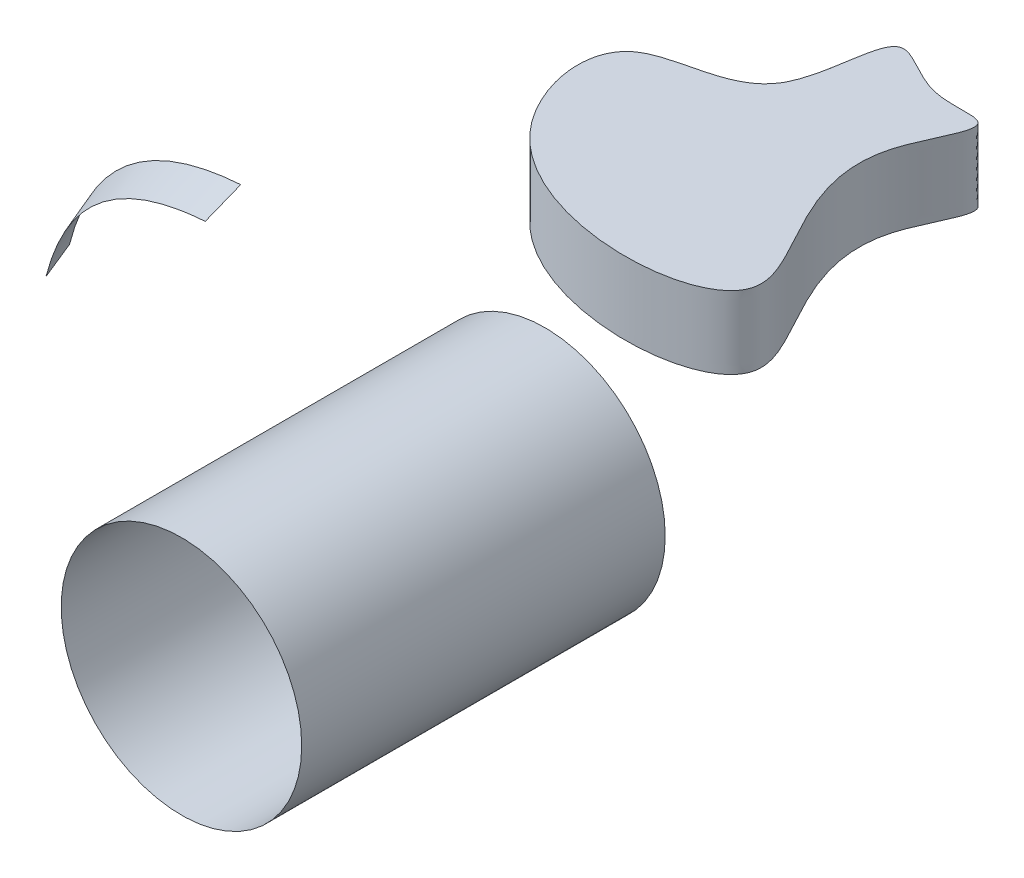
ISO-10303-21;
HEADER;
FILE_DESCRIPTION(('STEP AP214'),'2;1');
FILE_NAME('part.step','',(''),(''),'','','');
FILE_SCHEMA(('AUTOMOTIVE_DESIGN { 1 0 10303 214 1 1 1 1 }'));
ENDSEC;
DATA;
#1=APPLICATION_CONTEXT('core data for automotive mechanical design processes');
#2=APPLICATION_PROTOCOL_DEFINITION('international standard','automotive_design',2000,#1);
#3=PRODUCT_CONTEXT('',#1,'mechanical');
#4=PRODUCT('Part','Part','',(#3));
#5=PRODUCT_RELATED_PRODUCT_CATEGORY('part','',(#4));
#6=PRODUCT_DEFINITION_FORMATION('','',#4);
#7=PRODUCT_DEFINITION_CONTEXT('part definition',#1,'design');
#8=PRODUCT_DEFINITION('design','',#6,#7);
#9=PRODUCT_DEFINITION_SHAPE('','',#8);
#10=(LENGTH_UNIT() NAMED_UNIT(*) SI_UNIT(.MILLI.,.METRE.));
#11=(NAMED_UNIT(*) PLANE_ANGLE_UNIT() SI_UNIT($,.RADIAN.));
#12=(NAMED_UNIT(*) SI_UNIT($,.STERADIAN.) SOLID_ANGLE_UNIT());
#13=UNCERTAINTY_MEASURE_WITH_UNIT(LENGTH_MEASURE(1.E-05),#10,'distance_accuracy_value','');
#14=(GEOMETRIC_REPRESENTATION_CONTEXT(3) GLOBAL_UNCERTAINTY_ASSIGNED_CONTEXT((#13)) GLOBAL_UNIT_ASSIGNED_CONTEXT((#10,
#11,#12)) REPRESENTATION_CONTEXT('',''));
#15=CARTESIAN_POINT('',(0.,0.,0.));
#16=DIRECTION('',(0.,0.,1.));
#17=DIRECTION('',(1.,0.,0.));
#18=AXIS2_PLACEMENT_3D('',#15,#16,#17);
#19=CARTESIAN_POINT('',(-49.1507970621573,10.,-113.553148675584));
#20=CARTESIAN_POINT('',(-55.2439623804513,10.,-104.254853534053));
#21=CARTESIAN_POINT('',(-87.6743060870905,10.,-108.685326320553));
#22=CARTESIAN_POINT('',(-74.0903427954532,10.,-45.4823847950219));
#23=CARTESIAN_POINT('',(27.8354236460612,10.,-48.5070370287409));
#24=CARTESIAN_POINT('',(-32.4402889943373,10.,-97.9136858698389));
#25=CARTESIAN_POINT('',(-5.83480480371106,10.,-134.922849357029));
#26=CARTESIAN_POINT('',(-27.4973487823059,10.,-130.100372673364));
#27=CARTESIAN_POINT('',(-46.7711085310313,10.,-147.96430517599));
#28=CARTESIAN_POINT('',(-43.9525990307988,10.,-121.485705396896));
#29=CARTESIAN_POINT('',(-49.1507970621573,10.,-113.553148675584));
#30=B_SPLINE_CURVE_WITH_KNOTS('',3,(#19,#20,#21,#22,#23,#24,#25,#26,#27,#28,#29),.UNSPECIFIED.,
.T.,.F.,(4,1,1,1,1,1,1,1,4),(0.,0.119358610222687,0.247934810582562,0.506564167676508,
0.71354229957892,0.78558169847103,0.834101116400094,0.898172844445492,1.),.UNSPECIFIED.);
#31=DIRECTION('',(0.,-1.,0.));
#32=VECTOR('',#31,1.);
#33=SURFACE_OF_LINEAR_EXTRUSION('',#30,#32);
#34=CARTESIAN_POINT('',(-49.1507970621573,10.,-113.553148675584));
#35=VERTEX_POINT('',#34);
#36=EDGE_CURVE('E11',#35,#35,#30,.T.);
#37=ORIENTED_EDGE('',*,*,#36,.F.);
#38=EDGE_LOOP('',(#37));
#39=FACE_BOUND('',#38,.T.);
#40=CARTESIAN_POINT('',(-49.1507970621573,-10.,-113.553148675584));
#41=CARTESIAN_POINT('',(-55.2439623804513,-10.,-104.254853534053));
#42=CARTESIAN_POINT('',(-87.6743060870905,-10.,-108.685326320553));
#43=CARTESIAN_POINT('',(-74.0903427954532,-10.,-45.4823847950219));
#44=CARTESIAN_POINT('',(27.8354236460612,-10.,-48.5070370287409));
#45=CARTESIAN_POINT('',(-32.4402889943373,-10.,-97.9136858698389));
#46=CARTESIAN_POINT('',(-5.83480480371106,-10.,-134.922849357029));
#47=CARTESIAN_POINT('',(-27.4973487823059,-10.,-130.100372673364));
#48=CARTESIAN_POINT('',(-46.7711085310313,-10.,-147.96430517599));
#49=CARTESIAN_POINT('',(-43.9525990307988,-10.,-121.485705396896));
#50=CARTESIAN_POINT('',(-49.1507970621573,-10.,-113.553148675584));
#51=B_SPLINE_CURVE_WITH_KNOTS('',3,(#40,#41,#42,#43,#44,#45,#46,#47,#48,#49,#50),.UNSPECIFIED.,
.T.,.F.,(4,1,1,1,1,1,1,1,4),(0.,0.119358610222687,0.247934810582562,0.506564167676508,
0.71354229957892,0.78558169847103,0.834101116400094,0.898172844445492,1.),.UNSPECIFIED.);
#52=CARTESIAN_POINT('',(-49.1507970621573,-10.,-113.553148675584));
#53=VERTEX_POINT('',#52);
#54=EDGE_CURVE('E57',#53,#53,#51,.T.);
#55=ORIENTED_EDGE('',*,*,#54,.T.);
#56=EDGE_LOOP('',(#55));
#57=FACE_BOUND('',#56,.T.);
#58=ADVANCED_FACE('F48',(#39,#57),#33,.F.);
#59=CARTESIAN_POINT('',(-4.4064244063763,10.,-60.2147059790731));
#60=DIRECTION('',(0.,1.,0.));
#61=DIRECTION('',(0.,0.,1.));
#62=AXIS2_PLACEMENT_3D('',#59,#60,#61);
#63=PLANE('',#62);
#64=ORIENTED_EDGE('',*,*,#36,.T.);
#65=EDGE_LOOP('',(#64));
#66=FACE_BOUND('',#65,.T.);
#67=ADVANCED_FACE('F71',(#66),#63,.T.);
#68=CARTESIAN_POINT('',(-4.4064244063763,-10.,-60.2147059790731));
#69=DIRECTION('',(0.,1.,0.));
#70=DIRECTION('',(0.,0.,1.));
#71=AXIS2_PLACEMENT_3D('',#68,#69,#70);
#72=PLANE('',#71);
#73=ORIENTED_EDGE('',*,*,#54,.F.);
#74=EDGE_LOOP('',(#73));
#75=FACE_BOUND('',#74,.T.);
#76=ADVANCED_FACE('F69',(#75),#72,.F.);
#77=CLOSED_SHELL('',(#58,#67,#76));
#78=MANIFOLD_SOLID_BREP('B2',#77);
#79=CARTESIAN_POINT('',(-126.557612891766,-13.5715412728329,12.));
#80=CARTESIAN_POINT('',(-125.14176954202,-8.04668363658042,12.));
#81=CARTESIAN_POINT('',(-123.183113159023,-3.26128850542128,12.));
#82=CARTESIAN_POINT('',(-119.483069450398,2.88689513518648,12.));
#83=CARTESIAN_POINT('',(-118.122506250486,4.76536785843522,12.));
#84=CARTESIAN_POINT('',(-115.143083312909,8.20254817053011,12.));
#85=CARTESIAN_POINT('',(-113.524152555934,9.76162394055155,12.));
#86=CARTESIAN_POINT('',(-110.010913463695,12.5799366189427,12.));
#87=CARTESIAN_POINT('',(-108.116249867692,13.8393592746736,12.));
#88=CARTESIAN_POINT('',(-104.027657203746,16.0660406457448,12.));
#89=CARTESIAN_POINT('',(-101.833434332263,17.0331562848769,12.));
#90=CARTESIAN_POINT('',(-94.7725407963266,19.4882625084717,12.));
#91=CARTESIAN_POINT('',(-89.4254210975704,20.5290601458038,12.));
#92=CARTESIAN_POINT('',(-83.4097408692734,20.9292789511976,12.));
#93=CARTESIAN_POINT('',(-130.788535591325,-12.4872918381842,0.));
#94=CARTESIAN_POINT('',(-129.283275714458,-6.61351595311385,0.));
#95=CARTESIAN_POINT('',(-127.173312898665,-1.42121362979616,0.));
#96=CARTESIAN_POINT('',(-123.101314267023,5.34502951287495,0.));
#97=CARTESIAN_POINT('',(-121.592805655189,7.43007550335661,0.));
#98=CARTESIAN_POINT('',(-118.273436962312,11.2594307035249,0.));
#99=CARTESIAN_POINT('',(-116.462576881091,13.0037399132043,0.));
#100=CARTESIAN_POINT('',(-112.538505249513,16.151621551752,0.));
#101=CARTESIAN_POINT('',(-110.42529369902,17.5551939806293,0.));
#102=CARTESIAN_POINT('',(-105.896519128764,20.0216020575641,0.));
#103=CARTESIAN_POINT('',(-103.480956108973,21.0844377056341,0.));
#104=CARTESIAN_POINT('',(-95.780739845613,23.7618394786211,0.));
#105=CARTESIAN_POINT('',(-90.0425593980796,24.8653004323583,0.));
#106=CARTESIAN_POINT('',(-83.6996760118903,25.2872878244394,0.));
#107=B_SPLINE_SURFACE_WITH_KNOTS('',1,3,((#79,#80,#81,#82,#83,#84,#85,#86,#87,#88,#89,#90,#91,
#92),(#93,#94,#95,#96,#97,#98,#99,#100,#101,#102,#103,#104,#105,#106)),.UNSPECIFIED.,.F.,.F.,
.F.,(2,2),(4,2,2,2,2,2,4),(0.,1.),(0.,0.25,0.375,0.5,0.625,0.75,1.),.UNSPECIFIED.);
#108=CARTESIAN_POINT('',(-127.262766675026,-13.3908330337248,10.));
#109=CARTESIAN_POINT('',(-127.105232233546,-12.7761362897446,10.));
#110=CARTESIAN_POINT('',(-126.939283174916,-12.1635600113343,10.));
#111=CARTESIAN_POINT('',(-126.589115153142,-10.9416220611463,10.));
#112=CARTESIAN_POINT('',(-126.404841671629,-10.3322760291804,10.));
#113=CARTESIAN_POINT('',(-126.017163482523,-9.11837758887357,10.));
#114=CARTESIAN_POINT('',(-125.81372227551,-8.51383680397067,10.));
#115=CARTESIAN_POINT('',(-125.386874678091,-7.31114608847081,10.));
#116=CARTESIAN_POINT('',(-125.163448376967,-6.7130032111971,10.));
#117=CARTESIAN_POINT('',(-124.695837078698,-5.5246865820964,10.));
#118=CARTESIAN_POINT('',(-124.451646535272,-4.93451500855351,10.));
#119=CARTESIAN_POINT('',(-123.939774847032,-3.75914683757623,10.));
#120=CARTESIAN_POINT('',(-123.671930892352,-3.17402100516651,10.));
#121=CARTESIAN_POINT('',(-123.113713491849,-2.01506619395292,10.));
#122=CARTESIAN_POINT('',(-122.823354802332,-1.44123011988294,10.));
#123=CARTESIAN_POINT('',(-122.219476401098,-0.306412539074142,10.));
#124=CARTESIAN_POINT('',(-121.90597435977,0.254578355061305,10.));
#125=CARTESIAN_POINT('',(-121.255270240532,1.36219447582361,10.));
#126=CARTESIAN_POINT('',(-120.918082933221,1.90882836858519,10.));
#127=CARTESIAN_POINT('',(-120.219508750405,2.98625627851472,10.));
#128=CARTESIAN_POINT('',(-119.858127619234,3.51705401269421,10.));
#129=CARTESIAN_POINT('',(-119.164317811207,4.48655161937881,10.));
#130=CARTESIAN_POINT('',(-118.835130774058,4.92757365442932,10.));
#131=CARTESIAN_POINT('',(-118.15880904434,5.79574570838496,10.));
#132=CARTESIAN_POINT('',(-117.811671946533,6.22289385569368,10.));
#133=CARTESIAN_POINT('',(-117.099733316417,7.06221495772661,10.));
#134=CARTESIAN_POINT('',(-116.734931730338,7.4743878668599,10.));
#135=CARTESIAN_POINT('',(-115.988019683147,8.28272870600159,10.));
#136=CARTESIAN_POINT('',(-115.605909674829,8.67889705418164,10.));
#137=CARTESIAN_POINT('',(-114.827133583976,9.45203907448648,10.));
#138=CARTESIAN_POINT('',(-114.430564915166,9.8291108518601,10.));
#139=CARTESIAN_POINT('',(-113.621452682923,10.5657312724965,10.));
#140=CARTESIAN_POINT('',(-113.208908653039,10.9252794034079,10.));
#141=CARTESIAN_POINT('',(-112.368689817995,11.6262309184465,10.));
#142=CARTESIAN_POINT('',(-111.941015108272,11.967634416988,10.));
#143=CARTESIAN_POINT('',(-111.07145924061,12.6317698939573,10.));
#144=CARTESIAN_POINT('',(-110.629579075821,12.9545031732833,10.));
#145=CARTESIAN_POINT('',(-109.733759344892,13.5801019286207,10.));
#146=CARTESIAN_POINT('',(-109.279855930019,13.8830191581156,10.));
#147=CARTESIAN_POINT('',(-108.359867894621,14.4697852080268,10.));
#148=CARTESIAN_POINT('',(-107.893782086201,14.7536321592105,10.));
#149=CARTESIAN_POINT('',(-106.478946216095,15.5765119433698,10.));
#150=CARTESIAN_POINT('',(-105.513424200338,16.0870182465406,10.));
#151=CARTESIAN_POINT('',(-103.540800601718,17.0358438703616,10.));
#152=CARTESIAN_POINT('',(-102.533486269304,17.473716819129,10.));
#153=CARTESIAN_POINT('',(-100.490523150559,18.2771338363469,10.));
#154=CARTESIAN_POINT('',(-99.4548748036865,18.64267902587,10.));
#155=CARTESIAN_POINT('',(-97.5970998596934,19.2315330754152,10.));
#156=CARTESIAN_POINT('',(-96.7791978489353,19.4683536130137,10.));
#157=CARTESIAN_POINT('',(-95.1331231915175,19.9036613989749,10.));
#158=CARTESIAN_POINT('',(-94.3049488226121,20.1021421243148,10.));
#159=CARTESIAN_POINT('',(-92.6405411929084,20.463225749433,10.));
#160=CARTESIAN_POINT('',(-91.8043050339438,20.6258152032272,10.));
#161=CARTESIAN_POINT('',(-90.1366755539375,20.9156050411102,10.));
#162=CARTESIAN_POINT('',(-89.3053552342763,21.0432279339724,10.));
#163=CARTESIAN_POINT('',(-87.6390142531944,21.2679958902137,10.));
#164=CARTESIAN_POINT('',(-86.8039953735608,21.3651542890511,10.));
#165=CARTESIAN_POINT('',(-85.1322654675688,21.5310718185297,10.));
#166=CARTESIAN_POINT('',(-84.29555824095,21.599869064894,10.));
#167=CARTESIAN_POINT('',(-83.4580633930429,21.6556137634046,10.));
#168=B_SPLINE_CURVE_WITH_KNOTS('',3,(#108,#109,#110,#111,#112,#113,#114,#115,#116,#117,#118,
#119,#120,#121,#122,#123,#124,#125,#126,#127,#128,#129,#130,#131,#132,#133,#134,#135,#136,#137,
#138,#139,#140,#141,#142,#143,#144,#145,#146,#147,#148,#149,#150,#151,#152,#153,#154,#155,#156,
#157,#158,#159,#160,#161,#162,#163,#164,#165,#166,#167),.UNSPECIFIED.,.F.,.F.,(4,2,2,2,2,2,2,2,
2,2,2,2,2,2,2,2,2,2,2,2,2,2,2,2,2,2,2,2,2,4),(0.,1.90367916222511,3.81320193700515,
5.72643731248977,7.64160049756351,9.55727685337235,11.4873561583974,13.4161809985348,
15.3435480796651,17.2697237084708,19.19544361682,20.8459938362475,22.4967657989111,
24.1475427867978,25.7982766147881,27.4394245119352,29.0806203637549,30.7218058654898,
32.3628768751085,33.999475040445,35.6362333886932,38.9090451593821,42.2012793928765,
45.4934625930886,48.047031608969,50.6010346996359,53.1559929813976,55.6785611834023,
58.2000236155986,60.7180862152409),.UNSPECIFIED.);
#169=CARTESIAN_POINT('',(-127.262766675026,-13.3908330337248,10.));
#170=VERTEX_POINT('',#169);
#171=CARTESIAN_POINT('',(-83.4580633930429,21.6556137634046,10.));
#172=VERTEX_POINT('',#171);
#173=EDGE_CURVE('E127',#170,#172,#168,.T.);
#174=DIRECTION('',(-0.331313903324256,0.0849050994025502,-0.939692620785908));
#175=VECTOR('',#174,1.);
#176=CARTESIAN_POINT('',(-128.673074241546,-13.0294165555086,6.));
#177=LINE('',#176,#175);
#178=CARTESIAN_POINT('',(-130.788535591325,-12.4872918381842,0.));
#179=VERTEX_POINT('',#178);
#180=EDGE_CURVE('E109',#179,#170,#177,.F.);
#181=CARTESIAN_POINT('',(-130.788535591325,-12.4872918381842,0.));
#182=CARTESIAN_POINT('',(-121.756976328997,22.7553634718287,0.));
#183=CARTESIAN_POINT('',(-83.6996760118903,25.2872878244394,0.));
#184=B_SPLINE_CURVE_WITH_KNOTS('',2,(#181,#182,#183),.UNSPECIFIED.,.F.,.F.,(3,3),(0.,1.),.UNSPECIFIED.);
#185=CARTESIAN_POINT('',(-83.6996760118903,25.2872878244394,0.));
#186=VERTEX_POINT('',#185);
#187=EDGE_CURVE('E115',#179,#186,#184,.T.);
#188=DIRECTION('',(0.0227041595019683,-0.341265731625402,0.939692620785908));
#189=VECTOR('',#188,1.);
#190=CARTESIAN_POINT('',(-83.5547084405819,23.1082833878185,6.));
#191=LINE('',#190,#189);
#192=EDGE_CURVE('E46',#186,#172,#191,.T.);
#193=ORIENTED_EDGE('',*,*,#173,.F.);
#194=ORIENTED_EDGE('',*,*,#180,.F.);
#195=ORIENTED_EDGE('',*,*,#187,.T.);
#196=ORIENTED_EDGE('',*,*,#192,.T.);
#197=EDGE_LOOP('',(#193,#194,#195,#196));
#198=FACE_BOUND('',#197,.T.);
#199=ADVANCED_FACE('F106',(#198),#107,.T.);
#200=OPEN_SHELL('',(#199));
#201=SHELL_BASED_SURFACE_MODEL('B6',(#200));
#202=CARTESIAN_POINT('',(0.,0.,0.));
#203=DIRECTION('',(0.,0.,1.));
#204=DIRECTION('',(1.,0.,0.));
#205=AXIS2_PLACEMENT_3D('',#202,#203,#204);
#206=CYLINDRICAL_SURFACE('',#205,33.0882398077296);
#207=CARTESIAN_POINT('',(0.,0.,0.));
#208=DIRECTION('',(0.,0.,1.));
#209=DIRECTION('',(1.,0.,0.));
#210=AXIS2_PLACEMENT_3D('',#207,#208,#209);
#211=CIRCLE('',#210,33.0882398077296);
#212=CARTESIAN_POINT('',(33.0882398077296,0.,0.));
#213=VERTEX_POINT('',#212);
#214=EDGE_CURVE('E171',#213,#213,#211,.T.);
#215=ORIENTED_EDGE('',*,*,#214,.T.);
#216=EDGE_LOOP('',(#215));
#217=FACE_BOUND('',#216,.T.);
#218=CARTESIAN_POINT('',(0.,0.,100.));
#219=DIRECTION('',(0.,0.,1.));
#220=DIRECTION('',(1.,0.,0.));
#221=AXIS2_PLACEMENT_3D('',#218,#219,#220);
#222=CIRCLE('',#221,33.0882398077296);
#223=CARTESIAN_POINT('',(33.0882398077296,0.,100.));
#224=VERTEX_POINT('',#223);
#225=EDGE_CURVE('E105',#224,#224,#222,.T.);
#226=ORIENTED_EDGE('',*,*,#225,.F.);
#227=EDGE_LOOP('',(#226));
#228=FACE_BOUND('',#227,.T.);
#229=ADVANCED_FACE('F167',(#217,#228),#206,.T.);
#230=OPEN_SHELL('',(#229));
#231=SHELL_BASED_SURFACE_MODEL('B40',(#230));
#232=ADVANCED_BREP_SHAPE_REPRESENTATION('',(#18,#78),#14);
#233=MANIFOLD_SURFACE_SHAPE_REPRESENTATION('',(#18,#201,#231),#14);
#234=SHAPE_REPRESENTATION('',(#18),#14);
#235=SHAPE_DEFINITION_REPRESENTATION(#9,#234);
#236=SHAPE_REPRESENTATION_RELATIONSHIP('','',#234,#232);
#237=SHAPE_REPRESENTATION_RELATIONSHIP('','',#234,#233);
ENDSEC;
END-ISO-10303-21;
